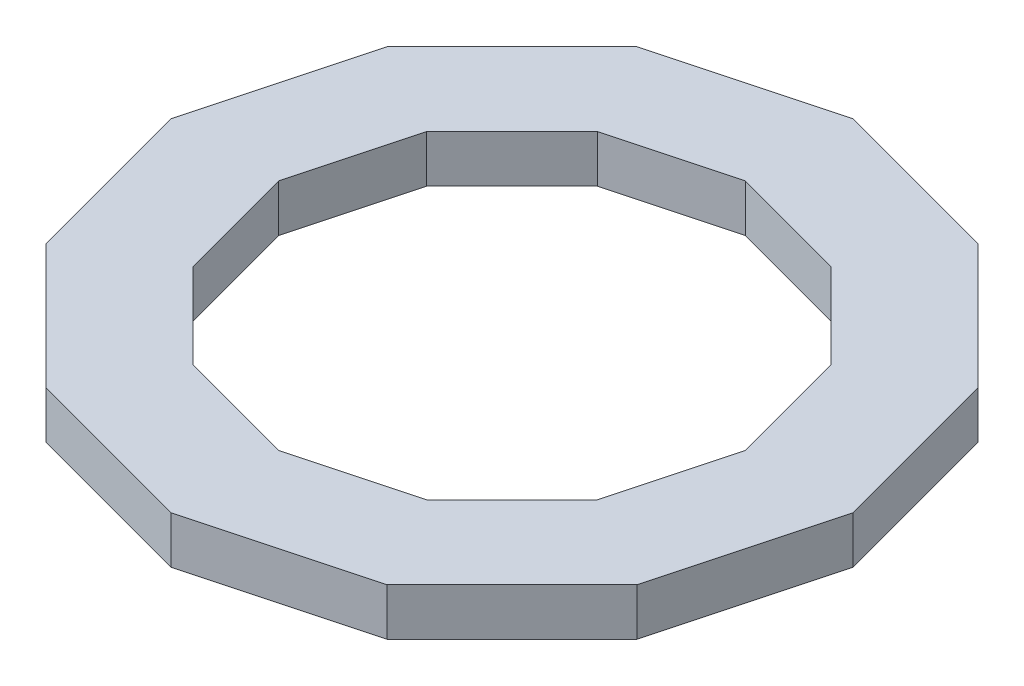
ISO-10303-21;
HEADER;
FILE_DESCRIPTION(('STEP AP214'),'2;1');
FILE_NAME('part.step','',(''),(''),'','','');
FILE_SCHEMA(('AUTOMOTIVE_DESIGN { 1 0 10303 214 1 1 1 1 }'));
ENDSEC;
DATA;
#1=APPLICATION_CONTEXT('core data for automotive mechanical design processes');
#2=APPLICATION_PROTOCOL_DEFINITION('international standard','automotive_design',2000,#1);
#3=PRODUCT_CONTEXT('',#1,'mechanical');
#4=PRODUCT('Part','Part','',(#3));
#5=PRODUCT_RELATED_PRODUCT_CATEGORY('part','',(#4));
#6=PRODUCT_DEFINITION_FORMATION('','',#4);
#7=PRODUCT_DEFINITION_CONTEXT('part definition',#1,'design');
#8=PRODUCT_DEFINITION('design','',#6,#7);
#9=PRODUCT_DEFINITION_SHAPE('','',#8);
#10=(LENGTH_UNIT() NAMED_UNIT(*) SI_UNIT(.MILLI.,.METRE.));
#11=(NAMED_UNIT(*) PLANE_ANGLE_UNIT() SI_UNIT($,.RADIAN.));
#12=(NAMED_UNIT(*) SI_UNIT($,.STERADIAN.) SOLID_ANGLE_UNIT());
#13=UNCERTAINTY_MEASURE_WITH_UNIT(LENGTH_MEASURE(1.E-05),#10,'distance_accuracy_value','');
#14=(GEOMETRIC_REPRESENTATION_CONTEXT(3) GLOBAL_UNCERTAINTY_ASSIGNED_CONTEXT((#13)) GLOBAL_UNIT_ASSIGNED_CONTEXT((#10,
#11,#12)) REPRESENTATION_CONTEXT('',''));
#15=CARTESIAN_POINT('',(0.,0.,0.));
#16=DIRECTION('',(0.,0.,1.));
#17=DIRECTION('',(1.,0.,0.));
#18=AXIS2_PLACEMENT_3D('',#15,#16,#17);
#19=CARTESIAN_POINT('',(0.,19.05,0.));
#20=DIRECTION('',(0.,1.,0.));
#21=DIRECTION('',(0.,0.,1.));
#22=AXIS2_PLACEMENT_3D('',#19,#20,#21);
#23=PLANE('',#22);
#24=DIRECTION('',(-0.258819045102521,0.,0.965925826289068));
#25=VECTOR('',#24,1.);
#26=CARTESIAN_POINT('',(-118.986079043665,19.05,-68.6966447656785));
#27=LINE('',#26,#25);
#28=CARTESIAN_POINT('',(-118.986079043665,19.05,-68.6966447656785));
#29=VERTEX_POINT('',#28);
#30=CARTESIAN_POINT('',(-137.393289531357,19.05,0.));
#31=VERTEX_POINT('',#30);
#32=EDGE_CURVE('E287',#29,#31,#27,.T.);
#33=ORIENTED_EDGE('',*,*,#32,.T.);
#34=DIRECTION('',(0.25881904510252,0.,0.965925826289068));
#35=VECTOR('',#34,1.);
#36=CARTESIAN_POINT('',(-137.393289531357,19.05,0.));
#37=LINE('',#36,#35);
#38=CARTESIAN_POINT('',(-118.986079043666,19.05,68.6966447656783));
#39=VERTEX_POINT('',#38);
#40=EDGE_CURVE('E290',#31,#39,#37,.T.);
#41=ORIENTED_EDGE('',*,*,#40,.T.);
#42=DIRECTION('',(0.707106781186547,0.,0.707106781186548));
#43=VECTOR('',#42,1.);
#44=CARTESIAN_POINT('',(-118.986079043666,19.05,68.6966447656783));
#45=LINE('',#44,#43);
#46=CARTESIAN_POINT('',(-68.6966447656785,19.05,118.986079043666));
#47=VERTEX_POINT('',#46);
#48=EDGE_CURVE('E293',#39,#47,#45,.T.);
#49=ORIENTED_EDGE('',*,*,#48,.T.);
#50=DIRECTION('',(0.965925826289068,0.,0.258819045102521));
#51=VECTOR('',#50,1.);
#52=CARTESIAN_POINT('',(-68.6966447656785,19.05,118.986079043666));
#53=LINE('',#52,#51);
#54=CARTESIAN_POINT('',(0.,19.05,137.393289531357));
#55=VERTEX_POINT('',#54);
#56=EDGE_CURVE('E295',#47,#55,#53,.T.);
#57=ORIENTED_EDGE('',*,*,#56,.T.);
#58=DIRECTION('',(0.965925826289069,0.,-0.25881904510252));
#59=VECTOR('',#58,1.);
#60=CARTESIAN_POINT('',(0.,19.05,137.393289531357));
#61=LINE('',#60,#59);
#62=CARTESIAN_POINT('',(68.6966447656783,19.05,118.986079043666));
#63=VERTEX_POINT('',#62);
#64=EDGE_CURVE('E297',#55,#63,#61,.T.);
#65=ORIENTED_EDGE('',*,*,#64,.T.);
#66=DIRECTION('',(0.707106781186548,0.,-0.707106781186547));
#67=VECTOR('',#66,1.);
#68=CARTESIAN_POINT('',(68.6966447656783,19.05,118.986079043666));
#69=LINE('',#68,#67);
#70=CARTESIAN_POINT('',(118.986079043666,19.05,68.6966447656785));
#71=VERTEX_POINT('',#70);
#72=EDGE_CURVE('E299',#63,#71,#69,.T.);
#73=ORIENTED_EDGE('',*,*,#72,.T.);
#74=DIRECTION('',(0.258819045102521,0.,-0.965925826289068));
#75=VECTOR('',#74,1.);
#76=CARTESIAN_POINT('',(118.986079043666,19.05,68.6966447656785));
#77=LINE('',#76,#75);
#78=CARTESIAN_POINT('',(137.393289531357,19.05,0.));
#79=VERTEX_POINT('',#78);
#80=EDGE_CURVE('E301',#71,#79,#77,.T.);
#81=ORIENTED_EDGE('',*,*,#80,.T.);
#82=DIRECTION('',(-0.25881904510252,0.,-0.965925826289068));
#83=VECTOR('',#82,1.);
#84=CARTESIAN_POINT('',(137.393289531357,19.05,0.));
#85=LINE('',#84,#83);
#86=CARTESIAN_POINT('',(118.986079043666,19.05,-68.6966447656783));
#87=VERTEX_POINT('',#86);
#88=EDGE_CURVE('E303',#79,#87,#85,.T.);
#89=ORIENTED_EDGE('',*,*,#88,.T.);
#90=DIRECTION('',(-0.707106781186547,0.,-0.707106781186548));
#91=VECTOR('',#90,1.);
#92=CARTESIAN_POINT('',(118.986079043666,19.05,-68.6966447656783));
#93=LINE('',#92,#91);
#94=CARTESIAN_POINT('',(68.6966447656785,19.05,-118.986079043666));
#95=VERTEX_POINT('',#94);
#96=EDGE_CURVE('E305',#87,#95,#93,.T.);
#97=ORIENTED_EDGE('',*,*,#96,.T.);
#98=DIRECTION('',(-0.965925826289068,0.,-0.258819045102521));
#99=VECTOR('',#98,1.);
#100=CARTESIAN_POINT('',(68.6966447656785,19.05,-118.986079043666));
#101=LINE('',#100,#99);
#102=CARTESIAN_POINT('',(0.,19.05,-137.393289531357));
#103=VERTEX_POINT('',#102);
#104=EDGE_CURVE('E307',#95,#103,#101,.T.);
#105=ORIENTED_EDGE('',*,*,#104,.T.);
#106=DIRECTION('',(-0.965925826289069,0.,0.25881904510252));
#107=VECTOR('',#106,1.);
#108=CARTESIAN_POINT('',(0.,19.05,-137.393289531357));
#109=LINE('',#108,#107);
#110=CARTESIAN_POINT('',(-68.6966447656783,19.05,-118.986079043666));
#111=VERTEX_POINT('',#110);
#112=EDGE_CURVE('E309',#103,#111,#109,.T.);
#113=ORIENTED_EDGE('',*,*,#112,.T.);
#114=DIRECTION('',(-0.707106781186548,0.,0.707106781186547));
#115=VECTOR('',#114,1.);
#116=CARTESIAN_POINT('',(-68.6966447656783,19.05,-118.986079043666));
#117=LINE('',#116,#115);
#118=EDGE_CURVE('E311',#111,#29,#117,.T.);
#119=ORIENTED_EDGE('',*,*,#118,.T.);
#120=EDGE_LOOP('',(#33,#41,#49,#57,#65,#73,#81,#89,#97,#105,#113,#119));
#121=FACE_BOUND('',#120,.T.);
#122=DIRECTION('',(0.258819045102521,0.,0.965925826289068));
#123=VECTOR('',#122,1.);
#124=CARTESIAN_POINT('',(-94.0048648103703,19.05,0.));
#125=LINE('',#124,#123);
#126=CARTESIAN_POINT('',(-94.0048648103703,19.05,0.));
#127=VERTEX_POINT('',#126);
#128=CARTESIAN_POINT('',(-81.4106010051025,19.05,47.0024324051852));
#129=VERTEX_POINT('',#128);
#130=EDGE_CURVE('E202',#127,#129,#125,.T.);
#131=ORIENTED_EDGE('',*,*,#130,.F.);
#132=DIRECTION('',(-0.258819045102521,0.,0.965925826289068));
#133=VECTOR('',#132,1.);
#134=CARTESIAN_POINT('',(-81.4106010051025,19.05,-47.0024324051852));
#135=LINE('',#134,#133);
#136=CARTESIAN_POINT('',(-81.4106010051025,19.05,-47.0024324051852));
#137=VERTEX_POINT('',#136);
#138=EDGE_CURVE('E194',#137,#127,#135,.T.);
#139=ORIENTED_EDGE('',*,*,#138,.F.);
#140=DIRECTION('',(-0.707106781186548,0.,0.707106781186547));
#141=VECTOR('',#140,1.);
#142=CARTESIAN_POINT('',(-47.0024324051851,19.05,-81.4106010051025));
#143=LINE('',#142,#141);
#144=CARTESIAN_POINT('',(-47.0024324051852,19.05,-81.4106010051025));
#145=VERTEX_POINT('',#144);
#146=EDGE_CURVE('E235',#145,#137,#143,.T.);
#147=ORIENTED_EDGE('',*,*,#146,.F.);
#148=DIRECTION('',(-0.965925826289068,0.,0.258819045102521));
#149=VECTOR('',#148,1.);
#150=CARTESIAN_POINT('',(0.,19.05,-94.0048648103703));
#151=LINE('',#150,#149);
#152=CARTESIAN_POINT('',(0.,19.05,-94.0048648103703));
#153=VERTEX_POINT('',#152);
#154=EDGE_CURVE('E233',#153,#145,#151,.T.);
#155=ORIENTED_EDGE('',*,*,#154,.F.);
#156=DIRECTION('',(-0.965925826289068,0.,-0.258819045102521));
#157=VECTOR('',#156,1.);
#158=CARTESIAN_POINT('',(47.0024324051851,19.05,-81.4106010051026));
#159=LINE('',#158,#157);
#160=CARTESIAN_POINT('',(47.0024324051851,19.05,-81.4106010051026));
#161=VERTEX_POINT('',#160);
#162=EDGE_CURVE('E231',#161,#153,#159,.T.);
#163=ORIENTED_EDGE('',*,*,#162,.F.);
#164=DIRECTION('',(-0.707106781186547,0.,-0.707106781186548));
#165=VECTOR('',#164,1.);
#166=CARTESIAN_POINT('',(81.4106010051025,19.05,-47.0024324051852));
#167=LINE('',#166,#165);
#168=CARTESIAN_POINT('',(81.4106010051025,19.05,-47.0024324051852));
#169=VERTEX_POINT('',#168);
#170=EDGE_CURVE('E229',#169,#161,#167,.T.);
#171=ORIENTED_EDGE('',*,*,#170,.F.);
#172=DIRECTION('',(-0.258819045102521,0.,-0.965925826289068));
#173=VECTOR('',#172,1.);
#174=CARTESIAN_POINT('',(94.0048648103703,19.05,0.));
#175=LINE('',#174,#173);
#176=CARTESIAN_POINT('',(94.0048648103703,19.05,0.));
#177=VERTEX_POINT('',#176);
#178=EDGE_CURVE('E227',#177,#169,#175,.T.);
#179=ORIENTED_EDGE('',*,*,#178,.F.);
#180=DIRECTION('',(0.258819045102521,0.,-0.965925826289068));
#181=VECTOR('',#180,1.);
#182=CARTESIAN_POINT('',(81.4106010051025,19.05,47.0024324051852));
#183=LINE('',#182,#181);
#184=CARTESIAN_POINT('',(81.4106010051025,19.05,47.0024324051852));
#185=VERTEX_POINT('',#184);
#186=EDGE_CURVE('E225',#185,#177,#183,.T.);
#187=ORIENTED_EDGE('',*,*,#186,.F.);
#188=DIRECTION('',(0.707106781186548,0.,-0.707106781186547));
#189=VECTOR('',#188,1.);
#190=CARTESIAN_POINT('',(47.0024324051852,19.05,81.4106010051025));
#191=LINE('',#190,#189);
#192=CARTESIAN_POINT('',(47.0024324051852,19.05,81.4106010051025));
#193=VERTEX_POINT('',#192);
#194=EDGE_CURVE('E223',#193,#185,#191,.T.);
#195=ORIENTED_EDGE('',*,*,#194,.F.);
#196=DIRECTION('',(0.965925826289068,0.,-0.258819045102521));
#197=VECTOR('',#196,1.);
#198=CARTESIAN_POINT('',(0.,19.05,94.0048648103703));
#199=LINE('',#198,#197);
#200=CARTESIAN_POINT('',(0.,19.05,94.0048648103703));
#201=VERTEX_POINT('',#200);
#202=EDGE_CURVE('E221',#201,#193,#199,.T.);
#203=ORIENTED_EDGE('',*,*,#202,.F.);
#204=DIRECTION('',(0.965925826289068,0.,0.258819045102521));
#205=VECTOR('',#204,1.);
#206=CARTESIAN_POINT('',(-47.0024324051852,19.05,81.4106010051025));
#207=LINE('',#206,#205);
#208=CARTESIAN_POINT('',(-47.0024324051852,19.05,81.4106010051025));
#209=VERTEX_POINT('',#208);
#210=EDGE_CURVE('E217',#209,#201,#207,.T.);
#211=ORIENTED_EDGE('',*,*,#210,.F.);
#212=DIRECTION('',(0.707106781186548,0.,0.707106781186547));
#213=VECTOR('',#212,1.);
#214=CARTESIAN_POINT('',(-81.4106010051025,19.05,47.0024324051852));
#215=LINE('',#214,#213);
#216=EDGE_CURVE('E215',#129,#209,#215,.T.);
#217=ORIENTED_EDGE('',*,*,#216,.F.);
#218=EDGE_LOOP('',(#131,#139,#147,#155,#163,#171,#179,#187,#195,#203,#211,#217));
#219=FACE_BOUND('',#218,.T.);
#220=ADVANCED_FACE('F33',(#121,#219),#23,.T.);
#221=CARTESIAN_POINT('',(0.,0.,0.));
#222=DIRECTION('',(0.,1.,0.));
#223=DIRECTION('',(0.,0.,1.));
#224=AXIS2_PLACEMENT_3D('',#221,#222,#223);
#225=PLANE('',#224);
#226=DIRECTION('',(-0.258819045102521,0.,0.965925826289068));
#227=VECTOR('',#226,1.);
#228=CARTESIAN_POINT('',(-118.986079043665,0.,-68.6966447656785));
#229=LINE('',#228,#227);
#230=CARTESIAN_POINT('',(-118.986079043665,0.,-68.6966447656785));
#231=VERTEX_POINT('',#230);
#232=CARTESIAN_POINT('',(-137.393289531357,0.,0.));
#233=VERTEX_POINT('',#232);
#234=EDGE_CURVE('E210',#231,#233,#229,.T.);
#235=ORIENTED_EDGE('',*,*,#234,.F.);
#236=DIRECTION('',(-0.707106781186548,0.,0.707106781186547));
#237=VECTOR('',#236,1.);
#238=CARTESIAN_POINT('',(-68.6966447656783,0.,-118.986079043666));
#239=LINE('',#238,#237);
#240=CARTESIAN_POINT('',(-68.6966447656783,0.,-118.986079043666));
#241=VERTEX_POINT('',#240);
#242=EDGE_CURVE('E291',#241,#231,#239,.T.);
#243=ORIENTED_EDGE('',*,*,#242,.F.);
#244=DIRECTION('',(-0.965925826289069,0.,0.25881904510252));
#245=VECTOR('',#244,1.);
#246=CARTESIAN_POINT('',(0.,0.,-137.393289531357));
#247=LINE('',#246,#245);
#248=CARTESIAN_POINT('',(0.,0.,-137.393289531357));
#249=VERTEX_POINT('',#248);
#250=EDGE_CURVE('E334',#249,#241,#247,.T.);
#251=ORIENTED_EDGE('',*,*,#250,.F.);
#252=DIRECTION('',(-0.965925826289068,0.,-0.258819045102521));
#253=VECTOR('',#252,1.);
#254=CARTESIAN_POINT('',(68.6966447656785,0.,-118.986079043666));
#255=LINE('',#254,#253);
#256=CARTESIAN_POINT('',(68.6966447656785,0.,-118.986079043666));
#257=VERTEX_POINT('',#256);
#258=EDGE_CURVE('E332',#257,#249,#255,.T.);
#259=ORIENTED_EDGE('',*,*,#258,.F.);
#260=DIRECTION('',(-0.707106781186547,0.,-0.707106781186548));
#261=VECTOR('',#260,1.);
#262=CARTESIAN_POINT('',(118.986079043666,0.,-68.6966447656783));
#263=LINE('',#262,#261);
#264=CARTESIAN_POINT('',(118.986079043666,0.,-68.6966447656783));
#265=VERTEX_POINT('',#264);
#266=EDGE_CURVE('E330',#265,#257,#263,.T.);
#267=ORIENTED_EDGE('',*,*,#266,.F.);
#268=DIRECTION('',(-0.25881904510252,0.,-0.965925826289068));
#269=VECTOR('',#268,1.);
#270=CARTESIAN_POINT('',(137.393289531357,0.,0.));
#271=LINE('',#270,#269);
#272=CARTESIAN_POINT('',(137.393289531357,0.,0.));
#273=VERTEX_POINT('',#272);
#274=EDGE_CURVE('E328',#273,#265,#271,.T.);
#275=ORIENTED_EDGE('',*,*,#274,.F.);
#276=DIRECTION('',(0.258819045102521,0.,-0.965925826289068));
#277=VECTOR('',#276,1.);
#278=CARTESIAN_POINT('',(118.986079043666,0.,68.6966447656785));
#279=LINE('',#278,#277);
#280=CARTESIAN_POINT('',(118.986079043666,0.,68.6966447656785));
#281=VERTEX_POINT('',#280);
#282=EDGE_CURVE('E326',#281,#273,#279,.T.);
#283=ORIENTED_EDGE('',*,*,#282,.F.);
#284=DIRECTION('',(0.707106781186548,0.,-0.707106781186547));
#285=VECTOR('',#284,1.);
#286=CARTESIAN_POINT('',(68.6966447656783,0.,118.986079043666));
#287=LINE('',#286,#285);
#288=CARTESIAN_POINT('',(68.6966447656783,0.,118.986079043666));
#289=VERTEX_POINT('',#288);
#290=EDGE_CURVE('E324',#289,#281,#287,.T.);
#291=ORIENTED_EDGE('',*,*,#290,.F.);
#292=DIRECTION('',(0.965925826289069,0.,-0.25881904510252));
#293=VECTOR('',#292,1.);
#294=CARTESIAN_POINT('',(0.,0.,137.393289531357));
#295=LINE('',#294,#293);
#296=CARTESIAN_POINT('',(0.,0.,137.393289531357));
#297=VERTEX_POINT('',#296);
#298=EDGE_CURVE('E322',#297,#289,#295,.T.);
#299=ORIENTED_EDGE('',*,*,#298,.F.);
#300=DIRECTION('',(0.965925826289068,0.,0.258819045102521));
#301=VECTOR('',#300,1.);
#302=CARTESIAN_POINT('',(-68.6966447656785,0.,118.986079043666));
#303=LINE('',#302,#301);
#304=CARTESIAN_POINT('',(-68.6966447656785,0.,118.986079043666));
#305=VERTEX_POINT('',#304);
#306=EDGE_CURVE('E320',#305,#297,#303,.T.);
#307=ORIENTED_EDGE('',*,*,#306,.F.);
#308=DIRECTION('',(0.707106781186547,0.,0.707106781186548));
#309=VECTOR('',#308,1.);
#310=CARTESIAN_POINT('',(-118.986079043666,0.,68.6966447656783));
#311=LINE('',#310,#309);
#312=CARTESIAN_POINT('',(-118.986079043666,0.,68.6966447656783));
#313=VERTEX_POINT('',#312);
#314=EDGE_CURVE('E318',#313,#305,#311,.T.);
#315=ORIENTED_EDGE('',*,*,#314,.F.);
#316=DIRECTION('',(0.25881904510252,0.,0.965925826289068));
#317=VECTOR('',#316,1.);
#318=CARTESIAN_POINT('',(-137.393289531357,0.,0.));
#319=LINE('',#318,#317);
#320=EDGE_CURVE('E316',#233,#313,#319,.T.);
#321=ORIENTED_EDGE('',*,*,#320,.F.);
#322=EDGE_LOOP('',(#235,#243,#251,#259,#267,#275,#283,#291,#299,#307,#315,#321));
#323=FACE_BOUND('',#322,.T.);
#324=DIRECTION('',(-0.258819045102521,0.,0.965925826289068));
#325=VECTOR('',#324,1.);
#326=CARTESIAN_POINT('',(-81.4106010051025,0.,-47.0024324051852));
#327=LINE('',#326,#325);
#328=CARTESIAN_POINT('',(-81.4106010051025,0.,-47.0024324051852));
#329=VERTEX_POINT('',#328);
#330=CARTESIAN_POINT('',(-94.0048648103703,0.,0.));
#331=VERTEX_POINT('',#330);
#332=EDGE_CURVE('E56',#329,#331,#327,.T.);
#333=ORIENTED_EDGE('',*,*,#332,.T.);
#334=DIRECTION('',(0.258819045102521,0.,0.965925826289068));
#335=VECTOR('',#334,1.);
#336=CARTESIAN_POINT('',(-94.0048648103703,0.,0.));
#337=LINE('',#336,#335);
#338=CARTESIAN_POINT('',(-81.4106010051025,0.,47.0024324051852));
#339=VERTEX_POINT('',#338);
#340=EDGE_CURVE('E209',#331,#339,#337,.T.);
#341=ORIENTED_EDGE('',*,*,#340,.T.);
#342=DIRECTION('',(0.707106781186548,0.,0.707106781186547));
#343=VECTOR('',#342,1.);
#344=CARTESIAN_POINT('',(-81.4106010051025,0.,47.0024324051852));
#345=LINE('',#344,#343);
#346=CARTESIAN_POINT('',(-47.0024324051852,0.,81.4106010051025));
#347=VERTEX_POINT('',#346);
#348=EDGE_CURVE('E239',#339,#347,#345,.T.);
#349=ORIENTED_EDGE('',*,*,#348,.T.);
#350=DIRECTION('',(0.965925826289068,0.,0.258819045102521));
#351=VECTOR('',#350,1.);
#352=CARTESIAN_POINT('',(-47.0024324051852,0.,81.4106010051025));
#353=LINE('',#352,#351);
#354=CARTESIAN_POINT('',(0.,0.,94.0048648103703));
#355=VERTEX_POINT('',#354);
#356=EDGE_CURVE('E242',#347,#355,#353,.T.);
#357=ORIENTED_EDGE('',*,*,#356,.T.);
#358=DIRECTION('',(0.965925826289068,0.,-0.258819045102521));
#359=VECTOR('',#358,1.);
#360=CARTESIAN_POINT('',(0.,0.,94.0048648103703));
#361=LINE('',#360,#359);
#362=CARTESIAN_POINT('',(47.0024324051852,0.,81.4106010051025));
#363=VERTEX_POINT('',#362);
#364=EDGE_CURVE('E245',#355,#363,#361,.T.);
#365=ORIENTED_EDGE('',*,*,#364,.T.);
#366=DIRECTION('',(0.707106781186548,0.,-0.707106781186547));
#367=VECTOR('',#366,1.);
#368=CARTESIAN_POINT('',(47.0024324051852,0.,81.4106010051025));
#369=LINE('',#368,#367);
#370=CARTESIAN_POINT('',(81.4106010051025,0.,47.0024324051852));
#371=VERTEX_POINT('',#370);
#372=EDGE_CURVE('E248',#363,#371,#369,.T.);
#373=ORIENTED_EDGE('',*,*,#372,.T.);
#374=DIRECTION('',(0.258819045102521,0.,-0.965925826289068));
#375=VECTOR('',#374,1.);
#376=CARTESIAN_POINT('',(81.4106010051025,0.,47.0024324051852));
#377=LINE('',#376,#375);
#378=CARTESIAN_POINT('',(94.0048648103703,0.,0.));
#379=VERTEX_POINT('',#378);
#380=EDGE_CURVE('E251',#371,#379,#377,.T.);
#381=ORIENTED_EDGE('',*,*,#380,.T.);
#382=DIRECTION('',(-0.258819045102521,0.,-0.965925826289068));
#383=VECTOR('',#382,1.);
#384=CARTESIAN_POINT('',(94.0048648103703,0.,0.));
#385=LINE('',#384,#383);
#386=CARTESIAN_POINT('',(81.4106010051025,0.,-47.0024324051852));
#387=VERTEX_POINT('',#386);
#388=EDGE_CURVE('E254',#379,#387,#385,.T.);
#389=ORIENTED_EDGE('',*,*,#388,.T.);
#390=DIRECTION('',(-0.707106781186547,0.,-0.707106781186548));
#391=VECTOR('',#390,1.);
#392=CARTESIAN_POINT('',(81.4106010051025,0.,-47.0024324051852));
#393=LINE('',#392,#391);
#394=CARTESIAN_POINT('',(47.0024324051851,0.,-81.4106010051026));
#395=VERTEX_POINT('',#394);
#396=EDGE_CURVE('E257',#387,#395,#393,.T.);
#397=ORIENTED_EDGE('',*,*,#396,.T.);
#398=DIRECTION('',(-0.965925826289068,0.,-0.258819045102521));
#399=VECTOR('',#398,1.);
#400=CARTESIAN_POINT('',(47.0024324051851,0.,-81.4106010051026));
#401=LINE('',#400,#399);
#402=CARTESIAN_POINT('',(0.,0.,-94.0048648103703));
#403=VERTEX_POINT('',#402);
#404=EDGE_CURVE('E260',#395,#403,#401,.T.);
#405=ORIENTED_EDGE('',*,*,#404,.T.);
#406=DIRECTION('',(-0.965925826289068,0.,0.258819045102521));
#407=VECTOR('',#406,1.);
#408=CARTESIAN_POINT('',(0.,0.,-94.0048648103703));
#409=LINE('',#408,#407);
#410=CARTESIAN_POINT('',(-47.0024324051851,0.,-81.4106010051025));
#411=VERTEX_POINT('',#410);
#412=EDGE_CURVE('E263',#403,#411,#409,.T.);
#413=ORIENTED_EDGE('',*,*,#412,.T.);
#414=DIRECTION('',(-0.707106781186548,0.,0.707106781186547));
#415=VECTOR('',#414,1.);
#416=CARTESIAN_POINT('',(-47.0024324051851,0.,-81.4106010051025));
#417=LINE('',#416,#415);
#418=EDGE_CURVE('E203',#411,#329,#417,.T.);
#419=ORIENTED_EDGE('',*,*,#418,.T.);
#420=EDGE_LOOP('',(#333,#341,#349,#357,#365,#373,#381,#389,#397,#405,#413,#419));
#421=FACE_BOUND('',#420,.T.);
#422=ADVANCED_FACE('F376',(#323,#421),#225,.F.);
#423=CARTESIAN_POINT('',(-118.986079043665,19.05,-68.6966447656785));
#424=DIRECTION('',(0.965925826289068,0.,0.258819045102521));
#425=DIRECTION('',(0.258819045102521,0.,-0.965925826289068));
#426=AXIS2_PLACEMENT_3D('',#423,#424,#425);
#427=PLANE('',#426);
#428=ORIENTED_EDGE('',*,*,#234,.T.);
#429=DIRECTION('',(0.,-1.,0.));
#430=VECTOR('',#429,1.);
#431=CARTESIAN_POINT('',(-137.393289531357,19.05,0.));
#432=LINE('',#431,#430);
#433=EDGE_CURVE('E11',#31,#233,#432,.T.);
#434=ORIENTED_EDGE('',*,*,#433,.F.);
#435=ORIENTED_EDGE('',*,*,#32,.F.);
#436=DIRECTION('',(0.,-1.,0.));
#437=VECTOR('',#436,1.);
#438=CARTESIAN_POINT('',(-118.986079043665,19.05,-68.6966447656785));
#439=LINE('',#438,#437);
#440=EDGE_CURVE('E313',#29,#231,#439,.T.);
#441=ORIENTED_EDGE('',*,*,#440,.T.);
#442=EDGE_LOOP('',(#428,#434,#435,#441));
#443=FACE_BOUND('',#442,.T.);
#444=ADVANCED_FACE('F35',(#443),#427,.F.);
#445=CARTESIAN_POINT('',(-137.393289531357,19.05,0.));
#446=DIRECTION('',(0.965925826289069,0.,-0.25881904510252));
#447=DIRECTION('',(-0.25881904510252,0.,-0.965925826289069));
#448=AXIS2_PLACEMENT_3D('',#445,#446,#447);
#449=PLANE('',#448);
#450=ORIENTED_EDGE('',*,*,#320,.T.);
#451=DIRECTION('',(0.,-1.,0.));
#452=VECTOR('',#451,1.);
#453=CARTESIAN_POINT('',(-118.986079043666,19.05,68.6966447656783));
#454=LINE('',#453,#452);
#455=EDGE_CURVE('E41',#39,#313,#454,.T.);
#456=ORIENTED_EDGE('',*,*,#455,.F.);
#457=ORIENTED_EDGE('',*,*,#40,.F.);
#458=ORIENTED_EDGE('',*,*,#433,.T.);
#459=EDGE_LOOP('',(#450,#456,#457,#458));
#460=FACE_BOUND('',#459,.T.);
#461=ADVANCED_FACE('F393',(#460),#449,.F.);
#462=CARTESIAN_POINT('',(-118.986079043666,19.05,68.6966447656783));
#463=DIRECTION('',(0.707106781186548,0.,-0.707106781186547));
#464=DIRECTION('',(-0.707106781186547,0.,-0.707106781186548));
#465=AXIS2_PLACEMENT_3D('',#462,#463,#464);
#466=PLANE('',#465);
#467=ORIENTED_EDGE('',*,*,#314,.T.);
#468=DIRECTION('',(0.,-1.,0.));
#469=VECTOR('',#468,1.);
#470=CARTESIAN_POINT('',(-68.6966447656785,19.05,118.986079043666));
#471=LINE('',#470,#469);
#472=EDGE_CURVE('E363',#47,#305,#471,.T.);
#473=ORIENTED_EDGE('',*,*,#472,.F.);
#474=ORIENTED_EDGE('',*,*,#48,.F.);
#475=ORIENTED_EDGE('',*,*,#455,.T.);
#476=EDGE_LOOP('',(#467,#473,#474,#475));
#477=FACE_BOUND('',#476,.T.);
#478=ADVANCED_FACE('F370',(#477),#466,.F.);
#479=CARTESIAN_POINT('',(-68.6966447656785,19.05,118.986079043666));
#480=DIRECTION('',(0.258819045102521,0.,-0.965925826289068));
#481=DIRECTION('',(-0.965925826289068,0.,-0.258819045102521));
#482=AXIS2_PLACEMENT_3D('',#479,#480,#481);
#483=PLANE('',#482);
#484=ORIENTED_EDGE('',*,*,#306,.T.);
#485=DIRECTION('',(0.,-1.,0.));
#486=VECTOR('',#485,1.);
#487=CARTESIAN_POINT('',(0.,19.05,137.393289531357));
#488=LINE('',#487,#486);
#489=EDGE_CURVE('E360',#55,#297,#488,.T.);
#490=ORIENTED_EDGE('',*,*,#489,.F.);
#491=ORIENTED_EDGE('',*,*,#56,.F.);
#492=ORIENTED_EDGE('',*,*,#472,.T.);
#493=EDGE_LOOP('',(#484,#490,#491,#492));
#494=FACE_BOUND('',#493,.T.);
#495=ADVANCED_FACE('F382',(#494),#483,.F.);
#496=CARTESIAN_POINT('',(0.,19.05,137.393289531357));
#497=DIRECTION('',(-0.25881904510252,0.,-0.965925826289068));
#498=DIRECTION('',(-0.965925826289069,0.,0.25881904510252));
#499=AXIS2_PLACEMENT_3D('',#496,#497,#498);
#500=PLANE('',#499);
#501=ORIENTED_EDGE('',*,*,#298,.T.);
#502=DIRECTION('',(0.,-1.,0.));
#503=VECTOR('',#502,1.);
#504=CARTESIAN_POINT('',(68.6966447656783,19.05,118.986079043666));
#505=LINE('',#504,#503);
#506=EDGE_CURVE('E357',#63,#289,#505,.T.);
#507=ORIENTED_EDGE('',*,*,#506,.F.);
#508=ORIENTED_EDGE('',*,*,#64,.F.);
#509=ORIENTED_EDGE('',*,*,#489,.T.);
#510=EDGE_LOOP('',(#501,#507,#508,#509));
#511=FACE_BOUND('',#510,.T.);
#512=ADVANCED_FACE('F386',(#511),#500,.F.);
#513=CARTESIAN_POINT('',(68.6966447656783,19.05,118.986079043666));
#514=DIRECTION('',(-0.707106781186547,0.,-0.707106781186548));
#515=DIRECTION('',(-0.707106781186548,0.,0.707106781186547));
#516=AXIS2_PLACEMENT_3D('',#513,#514,#515);
#517=PLANE('',#516);
#518=ORIENTED_EDGE('',*,*,#290,.T.);
#519=DIRECTION('',(0.,-1.,0.));
#520=VECTOR('',#519,1.);
#521=CARTESIAN_POINT('',(118.986079043666,19.05,68.6966447656785));
#522=LINE('',#521,#520);
#523=EDGE_CURVE('E354',#71,#281,#522,.T.);
#524=ORIENTED_EDGE('',*,*,#523,.F.);
#525=ORIENTED_EDGE('',*,*,#72,.F.);
#526=ORIENTED_EDGE('',*,*,#506,.T.);
#527=EDGE_LOOP('',(#518,#524,#525,#526));
#528=FACE_BOUND('',#527,.T.);
#529=ADVANCED_FACE('F426',(#528),#517,.F.);
#530=CARTESIAN_POINT('',(118.986079043666,19.05,68.6966447656785));
#531=DIRECTION('',(-0.965925826289068,0.,-0.258819045102521));
#532=DIRECTION('',(-0.258819045102521,0.,0.965925826289068));
#533=AXIS2_PLACEMENT_3D('',#530,#531,#532);
#534=PLANE('',#533);
#535=ORIENTED_EDGE('',*,*,#282,.T.);
#536=DIRECTION('',(0.,-1.,0.));
#537=VECTOR('',#536,1.);
#538=CARTESIAN_POINT('',(137.393289531357,19.05,0.));
#539=LINE('',#538,#537);
#540=EDGE_CURVE('E351',#79,#273,#539,.T.);
#541=ORIENTED_EDGE('',*,*,#540,.F.);
#542=ORIENTED_EDGE('',*,*,#80,.F.);
#543=ORIENTED_EDGE('',*,*,#523,.T.);
#544=EDGE_LOOP('',(#535,#541,#542,#543));
#545=FACE_BOUND('',#544,.T.);
#546=ADVANCED_FACE('F424',(#545),#534,.F.);
#547=CARTESIAN_POINT('',(137.393289531357,19.05,0.));
#548=DIRECTION('',(-0.965925826289069,0.,0.25881904510252));
#549=DIRECTION('',(0.25881904510252,0.,0.965925826289069));
#550=AXIS2_PLACEMENT_3D('',#547,#548,#549);
#551=PLANE('',#550);
#552=ORIENTED_EDGE('',*,*,#274,.T.);
#553=DIRECTION('',(0.,-1.,0.));
#554=VECTOR('',#553,1.);
#555=CARTESIAN_POINT('',(118.986079043666,19.05,-68.6966447656783));
#556=LINE('',#555,#554);
#557=EDGE_CURVE('E348',#87,#265,#556,.T.);
#558=ORIENTED_EDGE('',*,*,#557,.F.);
#559=ORIENTED_EDGE('',*,*,#88,.F.);
#560=ORIENTED_EDGE('',*,*,#540,.T.);
#561=EDGE_LOOP('',(#552,#558,#559,#560));
#562=FACE_BOUND('',#561,.T.);
#563=ADVANCED_FACE('F420',(#562),#551,.F.);
#564=CARTESIAN_POINT('',(118.986079043666,19.05,-68.6966447656783));
#565=DIRECTION('',(-0.707106781186548,0.,0.707106781186547));
#566=DIRECTION('',(0.707106781186547,0.,0.707106781186548));
#567=AXIS2_PLACEMENT_3D('',#564,#565,#566);
#568=PLANE('',#567);
#569=ORIENTED_EDGE('',*,*,#266,.T.);
#570=DIRECTION('',(0.,-1.,0.));
#571=VECTOR('',#570,1.);
#572=CARTESIAN_POINT('',(68.6966447656785,19.05,-118.986079043666));
#573=LINE('',#572,#571);
#574=EDGE_CURVE('E345',#95,#257,#573,.T.);
#575=ORIENTED_EDGE('',*,*,#574,.F.);
#576=ORIENTED_EDGE('',*,*,#96,.F.);
#577=ORIENTED_EDGE('',*,*,#557,.T.);
#578=EDGE_LOOP('',(#569,#575,#576,#577));
#579=FACE_BOUND('',#578,.T.);
#580=ADVANCED_FACE('F415',(#579),#568,.F.);
#581=CARTESIAN_POINT('',(68.6966447656785,19.05,-118.986079043666));
#582=DIRECTION('',(-0.258819045102521,0.,0.965925826289068));
#583=DIRECTION('',(0.965925826289068,0.,0.258819045102521));
#584=AXIS2_PLACEMENT_3D('',#581,#582,#583);
#585=PLANE('',#584);
#586=ORIENTED_EDGE('',*,*,#258,.T.);
#587=DIRECTION('',(0.,-1.,0.));
#588=VECTOR('',#587,1.);
#589=CARTESIAN_POINT('',(0.,19.05,-137.393289531357));
#590=LINE('',#589,#588);
#591=EDGE_CURVE('E342',#103,#249,#590,.T.);
#592=ORIENTED_EDGE('',*,*,#591,.F.);
#593=ORIENTED_EDGE('',*,*,#104,.F.);
#594=ORIENTED_EDGE('',*,*,#574,.T.);
#595=EDGE_LOOP('',(#586,#592,#593,#594));
#596=FACE_BOUND('',#595,.T.);
#597=ADVANCED_FACE('F409',(#596),#585,.F.);
#598=CARTESIAN_POINT('',(0.,19.05,-137.393289531357));
#599=DIRECTION('',(0.25881904510252,0.,0.965925826289068));
#600=DIRECTION('',(0.965925826289068,0.,-0.25881904510252));
#601=AXIS2_PLACEMENT_3D('',#598,#599,#600);
#602=PLANE('',#601);
#603=ORIENTED_EDGE('',*,*,#250,.T.);
#604=DIRECTION('',(0.,-1.,0.));
#605=VECTOR('',#604,1.);
#606=CARTESIAN_POINT('',(-68.6966447656783,19.05,-118.986079043666));
#607=LINE('',#606,#605);
#608=EDGE_CURVE('E339',#111,#241,#607,.T.);
#609=ORIENTED_EDGE('',*,*,#608,.F.);
#610=ORIENTED_EDGE('',*,*,#112,.F.);
#611=ORIENTED_EDGE('',*,*,#591,.T.);
#612=EDGE_LOOP('',(#603,#609,#610,#611));
#613=FACE_BOUND('',#612,.T.);
#614=ADVANCED_FACE('F405',(#613),#602,.F.);
#615=CARTESIAN_POINT('',(-68.6966447656783,19.05,-118.986079043666));
#616=DIRECTION('',(0.707106781186547,0.,0.707106781186548));
#617=DIRECTION('',(0.707106781186548,0.,-0.707106781186547));
#618=AXIS2_PLACEMENT_3D('',#615,#616,#617);
#619=PLANE('',#618);
#620=ORIENTED_EDGE('',*,*,#242,.T.);
#621=ORIENTED_EDGE('',*,*,#440,.F.);
#622=ORIENTED_EDGE('',*,*,#118,.F.);
#623=ORIENTED_EDGE('',*,*,#608,.T.);
#624=EDGE_LOOP('',(#620,#621,#622,#623));
#625=FACE_BOUND('',#624,.T.);
#626=ADVANCED_FACE('F400',(#625),#619,.F.);
#627=CARTESIAN_POINT('',(-81.4106010051025,19.05,-47.0024324051852));
#628=DIRECTION('',(0.965925826289068,0.,0.258819045102521));
#629=DIRECTION('',(0.258819045102521,0.,-0.965925826289068));
#630=AXIS2_PLACEMENT_3D('',#627,#628,#629);
#631=PLANE('',#630);
#632=ORIENTED_EDGE('',*,*,#332,.F.);
#633=DIRECTION('',(0.,-1.,0.));
#634=VECTOR('',#633,1.);
#635=CARTESIAN_POINT('',(-81.4106010051025,19.05,-47.0024324051852));
#636=LINE('',#635,#634);
#637=EDGE_CURVE('E198',#137,#329,#636,.T.);
#638=ORIENTED_EDGE('',*,*,#637,.F.);
#639=ORIENTED_EDGE('',*,*,#138,.T.);
#640=DIRECTION('',(0.,-1.,0.));
#641=VECTOR('',#640,1.);
#642=CARTESIAN_POINT('',(-94.0048648103703,19.05,0.));
#643=LINE('',#642,#641);
#644=EDGE_CURVE('E197',#127,#331,#643,.T.);
#645=ORIENTED_EDGE('',*,*,#644,.T.);
#646=EDGE_LOOP('',(#632,#638,#639,#645));
#647=FACE_BOUND('',#646,.T.);
#648=ADVANCED_FACE('F196',(#647),#631,.T.);
#649=CARTESIAN_POINT('',(-94.0048648103703,19.05,0.));
#650=DIRECTION('',(0.965925826289068,0.,-0.258819045102521));
#651=DIRECTION('',(-0.258819045102521,0.,-0.965925826289068));
#652=AXIS2_PLACEMENT_3D('',#649,#650,#651);
#653=PLANE('',#652);
#654=ORIENTED_EDGE('',*,*,#340,.F.);
#655=ORIENTED_EDGE('',*,*,#644,.F.);
#656=ORIENTED_EDGE('',*,*,#130,.T.);
#657=DIRECTION('',(0.,-1.,0.));
#658=VECTOR('',#657,1.);
#659=CARTESIAN_POINT('',(-81.4106010051025,19.05,47.0024324051852));
#660=LINE('',#659,#658);
#661=EDGE_CURVE('E211',#129,#339,#660,.T.);
#662=ORIENTED_EDGE('',*,*,#661,.T.);
#663=EDGE_LOOP('',(#654,#655,#656,#662));
#664=FACE_BOUND('',#663,.T.);
#665=ADVANCED_FACE('F206',(#664),#653,.T.);
#666=CARTESIAN_POINT('',(-81.4106010051025,19.05,47.0024324051852));
#667=DIRECTION('',(0.707106781186547,0.,-0.707106781186548));
#668=DIRECTION('',(-0.707106781186548,0.,-0.707106781186547));
#669=AXIS2_PLACEMENT_3D('',#666,#667,#668);
#670=PLANE('',#669);
#671=ORIENTED_EDGE('',*,*,#348,.F.);
#672=ORIENTED_EDGE('',*,*,#661,.F.);
#673=ORIENTED_EDGE('',*,*,#216,.T.);
#674=DIRECTION('',(0.,-1.,0.));
#675=VECTOR('',#674,1.);
#676=CARTESIAN_POINT('',(-47.0024324051852,19.05,81.4106010051025));
#677=LINE('',#676,#675);
#678=EDGE_CURVE('E284',#209,#347,#677,.T.);
#679=ORIENTED_EDGE('',*,*,#678,.T.);
#680=EDGE_LOOP('',(#671,#672,#673,#679));
#681=FACE_BOUND('',#680,.T.);
#682=ADVANCED_FACE('F484',(#681),#670,.T.);
#683=CARTESIAN_POINT('',(-47.0024324051852,19.05,81.4106010051025));
#684=DIRECTION('',(0.258819045102521,0.,-0.965925826289068));
#685=DIRECTION('',(-0.965925826289068,0.,-0.258819045102521));
#686=AXIS2_PLACEMENT_3D('',#683,#684,#685);
#687=PLANE('',#686);
#688=ORIENTED_EDGE('',*,*,#356,.F.);
#689=ORIENTED_EDGE('',*,*,#678,.F.);
#690=ORIENTED_EDGE('',*,*,#210,.T.);
#691=DIRECTION('',(0.,-1.,0.));
#692=VECTOR('',#691,1.);
#693=CARTESIAN_POINT('',(0.,19.05,94.0048648103703));
#694=LINE('',#693,#692);
#695=EDGE_CURVE('E282',#201,#355,#694,.T.);
#696=ORIENTED_EDGE('',*,*,#695,.T.);
#697=EDGE_LOOP('',(#688,#689,#690,#696));
#698=FACE_BOUND('',#697,.T.);
#699=ADVANCED_FACE('F490',(#698),#687,.T.);
#700=CARTESIAN_POINT('',(0.,19.05,94.0048648103703));
#701=DIRECTION('',(-0.258819045102521,0.,-0.965925826289068));
#702=DIRECTION('',(-0.965925826289068,0.,0.258819045102521));
#703=AXIS2_PLACEMENT_3D('',#700,#701,#702);
#704=PLANE('',#703);
#705=ORIENTED_EDGE('',*,*,#364,.F.);
#706=ORIENTED_EDGE('',*,*,#695,.F.);
#707=ORIENTED_EDGE('',*,*,#202,.T.);
#708=DIRECTION('',(0.,-1.,0.));
#709=VECTOR('',#708,1.);
#710=CARTESIAN_POINT('',(47.0024324051852,19.05,81.4106010051025));
#711=LINE('',#710,#709);
#712=EDGE_CURVE('E280',#193,#363,#711,.T.);
#713=ORIENTED_EDGE('',*,*,#712,.T.);
#714=EDGE_LOOP('',(#705,#706,#707,#713));
#715=FACE_BOUND('',#714,.T.);
#716=ADVANCED_FACE('F498',(#715),#704,.T.);
#717=CARTESIAN_POINT('',(47.0024324051852,19.05,81.4106010051025));
#718=DIRECTION('',(-0.707106781186547,0.,-0.707106781186548));
#719=DIRECTION('',(-0.707106781186548,0.,0.707106781186547));
#720=AXIS2_PLACEMENT_3D('',#717,#718,#719);
#721=PLANE('',#720);
#722=ORIENTED_EDGE('',*,*,#372,.F.);
#723=ORIENTED_EDGE('',*,*,#712,.F.);
#724=ORIENTED_EDGE('',*,*,#194,.T.);
#725=DIRECTION('',(0.,-1.,0.));
#726=VECTOR('',#725,1.);
#727=CARTESIAN_POINT('',(81.4106010051025,19.05,47.0024324051852));
#728=LINE('',#727,#726);
#729=EDGE_CURVE('E278',#185,#371,#728,.T.);
#730=ORIENTED_EDGE('',*,*,#729,.T.);
#731=EDGE_LOOP('',(#722,#723,#724,#730));
#732=FACE_BOUND('',#731,.T.);
#733=ADVANCED_FACE('F506',(#732),#721,.T.);
#734=CARTESIAN_POINT('',(81.4106010051025,19.05,47.0024324051852));
#735=DIRECTION('',(-0.965925826289068,0.,-0.258819045102521));
#736=DIRECTION('',(-0.258819045102521,0.,0.965925826289068));
#737=AXIS2_PLACEMENT_3D('',#734,#735,#736);
#738=PLANE('',#737);
#739=ORIENTED_EDGE('',*,*,#380,.F.);
#740=ORIENTED_EDGE('',*,*,#729,.F.);
#741=ORIENTED_EDGE('',*,*,#186,.T.);
#742=DIRECTION('',(0.,-1.,0.));
#743=VECTOR('',#742,1.);
#744=CARTESIAN_POINT('',(94.0048648103703,19.05,0.));
#745=LINE('',#744,#743);
#746=EDGE_CURVE('E276',#177,#379,#745,.T.);
#747=ORIENTED_EDGE('',*,*,#746,.T.);
#748=EDGE_LOOP('',(#739,#740,#741,#747));
#749=FACE_BOUND('',#748,.T.);
#750=ADVANCED_FACE('F514',(#749),#738,.T.);
#751=CARTESIAN_POINT('',(94.0048648103703,19.05,0.));
#752=DIRECTION('',(-0.965925826289068,0.,0.258819045102521));
#753=DIRECTION('',(0.258819045102521,0.,0.965925826289068));
#754=AXIS2_PLACEMENT_3D('',#751,#752,#753);
#755=PLANE('',#754);
#756=ORIENTED_EDGE('',*,*,#388,.F.);
#757=ORIENTED_EDGE('',*,*,#746,.F.);
#758=ORIENTED_EDGE('',*,*,#178,.T.);
#759=DIRECTION('',(0.,-1.,0.));
#760=VECTOR('',#759,1.);
#761=CARTESIAN_POINT('',(81.4106010051025,19.05,-47.0024324051852));
#762=LINE('',#761,#760);
#763=EDGE_CURVE('E274',#169,#387,#762,.T.);
#764=ORIENTED_EDGE('',*,*,#763,.T.);
#765=EDGE_LOOP('',(#756,#757,#758,#764));
#766=FACE_BOUND('',#765,.T.);
#767=ADVANCED_FACE('F522',(#766),#755,.T.);
#768=CARTESIAN_POINT('',(81.4106010051025,19.05,-47.0024324051852));
#769=DIRECTION('',(-0.707106781186548,0.,0.707106781186547));
#770=DIRECTION('',(0.707106781186547,0.,0.707106781186548));
#771=AXIS2_PLACEMENT_3D('',#768,#769,#770);
#772=PLANE('',#771);
#773=ORIENTED_EDGE('',*,*,#396,.F.);
#774=ORIENTED_EDGE('',*,*,#763,.F.);
#775=ORIENTED_EDGE('',*,*,#170,.T.);
#776=DIRECTION('',(0.,-1.,0.));
#777=VECTOR('',#776,1.);
#778=CARTESIAN_POINT('',(47.0024324051851,19.05,-81.4106010051026));
#779=LINE('',#778,#777);
#780=EDGE_CURVE('E272',#161,#395,#779,.T.);
#781=ORIENTED_EDGE('',*,*,#780,.T.);
#782=EDGE_LOOP('',(#773,#774,#775,#781));
#783=FACE_BOUND('',#782,.T.);
#784=ADVANCED_FACE('F530',(#783),#772,.T.);
#785=CARTESIAN_POINT('',(47.0024324051851,19.05,-81.4106010051026));
#786=DIRECTION('',(-0.258819045102521,0.,0.965925826289068));
#787=DIRECTION('',(0.965925826289068,0.,0.258819045102521));
#788=AXIS2_PLACEMENT_3D('',#785,#786,#787);
#789=PLANE('',#788);
#790=ORIENTED_EDGE('',*,*,#404,.F.);
#791=ORIENTED_EDGE('',*,*,#780,.F.);
#792=ORIENTED_EDGE('',*,*,#162,.T.);
#793=DIRECTION('',(0.,-1.,0.));
#794=VECTOR('',#793,1.);
#795=CARTESIAN_POINT('',(0.,19.05,-94.0048648103703));
#796=LINE('',#795,#794);
#797=EDGE_CURVE('E270',#153,#403,#796,.T.);
#798=ORIENTED_EDGE('',*,*,#797,.T.);
#799=EDGE_LOOP('',(#790,#791,#792,#798));
#800=FACE_BOUND('',#799,.T.);
#801=ADVANCED_FACE('F538',(#800),#789,.T.);
#802=CARTESIAN_POINT('',(0.,19.05,-94.0048648103703));
#803=DIRECTION('',(0.258819045102521,0.,0.965925826289068));
#804=DIRECTION('',(0.965925826289068,0.,-0.258819045102521));
#805=AXIS2_PLACEMENT_3D('',#802,#803,#804);
#806=PLANE('',#805);
#807=ORIENTED_EDGE('',*,*,#412,.F.);
#808=ORIENTED_EDGE('',*,*,#797,.F.);
#809=ORIENTED_EDGE('',*,*,#154,.T.);
#810=DIRECTION('',(0.,-1.,0.));
#811=VECTOR('',#810,1.);
#812=CARTESIAN_POINT('',(-47.0024324051851,19.05,-81.4106010051025));
#813=LINE('',#812,#811);
#814=EDGE_CURVE('E48',#145,#411,#813,.T.);
#815=ORIENTED_EDGE('',*,*,#814,.T.);
#816=EDGE_LOOP('',(#807,#808,#809,#815));
#817=FACE_BOUND('',#816,.T.);
#818=ADVANCED_FACE('F546',(#817),#806,.T.);
#819=CARTESIAN_POINT('',(-47.0024324051851,19.05,-81.4106010051025));
#820=DIRECTION('',(0.707106781186547,0.,0.707106781186548));
#821=DIRECTION('',(0.707106781186548,0.,-0.707106781186547));
#822=AXIS2_PLACEMENT_3D('',#819,#820,#821);
#823=PLANE('',#822);
#824=ORIENTED_EDGE('',*,*,#418,.F.);
#825=ORIENTED_EDGE('',*,*,#814,.F.);
#826=ORIENTED_EDGE('',*,*,#146,.T.);
#827=ORIENTED_EDGE('',*,*,#637,.T.);
#828=EDGE_LOOP('',(#824,#825,#826,#827));
#829=FACE_BOUND('',#828,.T.);
#830=ADVANCED_FACE('F554',(#829),#823,.T.);
#831=CLOSED_SHELL('',(#220,#422,#444,#461,#478,#495,#512,#529,#546,#563,#580,#597,#614,#626,
#648,#665,#682,#699,#716,#733,#750,#767,#784,#801,#818,#830));
#832=MANIFOLD_SOLID_BREP('B2',#831);
#833=ADVANCED_BREP_SHAPE_REPRESENTATION('',(#18,#832),#14);
#834=SHAPE_DEFINITION_REPRESENTATION(#9,#833);
ENDSEC;
END-ISO-10303-21;
